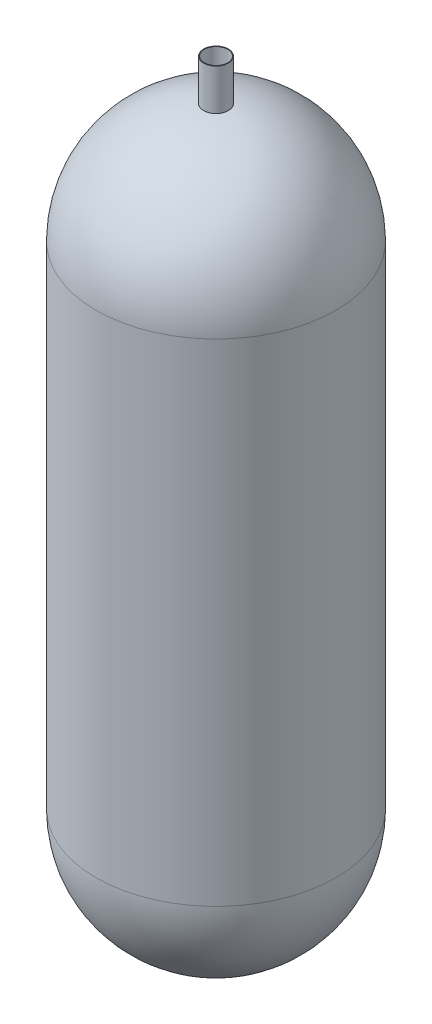
ISO-10303-21;
HEADER;
FILE_DESCRIPTION(('STEP AP214'),'2;1');
FILE_NAME('part.step','',(''),(''),'','','');
FILE_SCHEMA(('AUTOMOTIVE_DESIGN { 1 0 10303 214 1 1 1 1 }'));
ENDSEC;
DATA;
#1=APPLICATION_CONTEXT('core data for automotive mechanical design processes');
#2=APPLICATION_PROTOCOL_DEFINITION('international standard','automotive_design',2000,#1);
#3=PRODUCT_CONTEXT('',#1,'mechanical');
#4=PRODUCT('Part','Part','',(#3));
#5=PRODUCT_RELATED_PRODUCT_CATEGORY('part','',(#4));
#6=PRODUCT_DEFINITION_FORMATION('','',#4);
#7=PRODUCT_DEFINITION_CONTEXT('part definition',#1,'design');
#8=PRODUCT_DEFINITION('design','',#6,#7);
#9=PRODUCT_DEFINITION_SHAPE('','',#8);
#10=(LENGTH_UNIT() NAMED_UNIT(*) SI_UNIT(.MILLI.,.METRE.));
#11=(NAMED_UNIT(*) PLANE_ANGLE_UNIT() SI_UNIT($,.RADIAN.));
#12=(NAMED_UNIT(*) SI_UNIT($,.STERADIAN.) SOLID_ANGLE_UNIT());
#13=UNCERTAINTY_MEASURE_WITH_UNIT(LENGTH_MEASURE(1.E-05),#10,'distance_accuracy_value','');
#14=(GEOMETRIC_REPRESENTATION_CONTEXT(3) GLOBAL_UNCERTAINTY_ASSIGNED_CONTEXT((#13)) GLOBAL_UNIT_ASSIGNED_CONTEXT((#10,
#11,#12)) REPRESENTATION_CONTEXT('',''));
#15=CARTESIAN_POINT('',(0.,0.,0.));
#16=DIRECTION('',(0.,0.,1.));
#17=DIRECTION('',(1.,0.,0.));
#18=AXIS2_PLACEMENT_3D('',#15,#16,#17);
#19=CARTESIAN_POINT('',(0.,84.2306265294641,0.));
#20=DIRECTION('',(0.,1.,0.));
#21=DIRECTION('',(-1.,0.,0.));
#22=AXIS2_PLACEMENT_3D('',#19,#20,#21);
#23=SPHERICAL_SURFACE('',#22,74.4999999999999);
#24=CARTESIAN_POINT('',(0.,84.2306265294641,0.));
#25=DIRECTION('',(0.,1.,0.));
#26=DIRECTION('',(0.,0.,1.));
#27=AXIS2_PLACEMENT_3D('',#24,#25,#26);
#28=CIRCLE('',#27,74.4999999999999);
#29=CARTESIAN_POINT('',(0.,84.2306265294641,74.4999999999999));
#30=VERTEX_POINT('',#29);
#31=EDGE_CURVE('E11',#30,#30,#28,.T.);
#32=ORIENTED_EDGE('',*,*,#31,.T.);
#33=EDGE_LOOP('',(#32));
#34=FACE_BOUND('',#33,.T.);
#35=ADVANCED_FACE('F40',(#34),#23,.F.);
#36=CARTESIAN_POINT('',(0.,757.133757102828,0.));
#37=DIRECTION('',(0.,1.,0.));
#38=DIRECTION('',(0.,0.,1.));
#39=AXIS2_PLACEMENT_3D('',#36,#37,#38);
#40=CYLINDRICAL_SURFACE('',#39,74.4999999999999);
#41=ORIENTED_EDGE('',*,*,#31,.F.);
#42=EDGE_LOOP('',(#41));
#43=FACE_BOUND('',#42,.T.);
#44=CARTESIAN_POINT('',(0.,442.96408787173,0.));
#45=DIRECTION('',(0.,1.,0.));
#46=DIRECTION('',(0.,0.,1.));
#47=AXIS2_PLACEMENT_3D('',#44,#45,#46);
#48=CIRCLE('',#47,74.4999999999999);
#49=CARTESIAN_POINT('',(0.,442.96408787173,74.4999999999999));
#50=VERTEX_POINT('',#49);
#51=EDGE_CURVE('E49',#50,#50,#48,.T.);
#52=ORIENTED_EDGE('',*,*,#51,.T.);
#53=EDGE_LOOP('',(#52));
#54=FACE_BOUND('',#53,.T.);
#55=ADVANCED_FACE('F94',(#43,#54),#40,.F.);
#56=CARTESIAN_POINT('',(0.,442.96408787173,0.));
#57=DIRECTION('',(0.,1.,0.));
#58=DIRECTION('',(-1.,0.,0.));
#59=AXIS2_PLACEMENT_3D('',#56,#57,#58);
#60=SPHERICAL_SURFACE('',#59,74.5);
#61=CARTESIAN_POINT('',(0.,516.977600151583,0.));
#62=DIRECTION('',(0.,-1.,0.));
#63=DIRECTION('',(0.,0.,-1.));
#64=AXIS2_PLACEMENT_3D('',#61,#62,#63);
#65=CIRCLE('',#64,8.5);
#66=CARTESIAN_POINT('',(0.,516.977600151583,-8.5));
#67=VERTEX_POINT('',#66);
#68=EDGE_CURVE('E44',#67,#67,#65,.F.);
#69=ORIENTED_EDGE('',*,*,#68,.T.);
#70=EDGE_LOOP('',(#69));
#71=FACE_BOUND('',#70,.T.);
#72=ORIENTED_EDGE('',*,*,#51,.F.);
#73=EDGE_LOOP('',(#72));
#74=FACE_BOUND('',#73,.T.);
#75=ADVANCED_FACE('F42',(#71,#74),#60,.F.);
#76=CARTESIAN_POINT('',(0.,510.,0.));
#77=DIRECTION('',(0.,1.,0.));
#78=DIRECTION('',(0.,0.,1.));
#79=AXIS2_PLACEMENT_3D('',#76,#77,#78);
#80=CYLINDRICAL_SURFACE('',#79,8.5);
#81=CARTESIAN_POINT('',(0.,560.,0.));
#82=DIRECTION('',(0.,1.,0.));
#83=DIRECTION('',(0.,0.,1.));
#84=AXIS2_PLACEMENT_3D('',#81,#82,#83);
#85=CIRCLE('',#84,8.5);
#86=CARTESIAN_POINT('',(0.,560.,8.5));
#87=VERTEX_POINT('',#86);
#88=EDGE_CURVE('E72',#87,#87,#85,.T.);
#89=ORIENTED_EDGE('',*,*,#88,.T.);
#90=EDGE_LOOP('',(#89));
#91=FACE_BOUND('',#90,.T.);
#92=ORIENTED_EDGE('',*,*,#68,.F.);
#93=EDGE_LOOP('',(#92));
#94=FACE_BOUND('',#93,.T.);
#95=ADVANCED_FACE('F83',(#91,#94),#80,.F.);
#96=CARTESIAN_POINT('',(0.,84.2306265294641,0.));
#97=DIRECTION('',(0.,1.,0.));
#98=DIRECTION('',(-1.,0.,0.));
#99=AXIS2_PLACEMENT_3D('',#96,#97,#98);
#100=SPHERICAL_SURFACE('',#99,87.4999999999999);
#101=CARTESIAN_POINT('',(0.,84.2306265294641,0.));
#102=DIRECTION('',(0.,1.,0.));
#103=DIRECTION('',(0.,0.,1.));
#104=AXIS2_PLACEMENT_3D('',#101,#102,#103);
#105=CIRCLE('',#104,87.4999999999999);
#106=CARTESIAN_POINT('',(0.,84.2306265294641,87.4999999999999));
#107=VERTEX_POINT('',#106);
#108=EDGE_CURVE('E55',#107,#107,#105,.T.);
#109=ORIENTED_EDGE('',*,*,#108,.F.);
#110=EDGE_LOOP('',(#109));
#111=FACE_BOUND('',#110,.T.);
#112=ADVANCED_FACE('F85',(#111),#100,.T.);
#113=CARTESIAN_POINT('',(0.,757.133757102828,0.));
#114=DIRECTION('',(0.,1.,0.));
#115=DIRECTION('',(0.,0.,1.));
#116=AXIS2_PLACEMENT_3D('',#113,#114,#115);
#117=CYLINDRICAL_SURFACE('',#116,87.4999999999999);
#118=ORIENTED_EDGE('',*,*,#108,.T.);
#119=EDGE_LOOP('',(#118));
#120=FACE_BOUND('',#119,.T.);
#121=CARTESIAN_POINT('',(0.,442.96408787173,0.));
#122=DIRECTION('',(0.,1.,0.));
#123=DIRECTION('',(0.,0.,1.));
#124=AXIS2_PLACEMENT_3D('',#121,#122,#123);
#125=CIRCLE('',#124,87.4999999999999);
#126=CARTESIAN_POINT('',(0.,442.96408787173,87.4999999999999));
#127=VERTEX_POINT('',#126);
#128=EDGE_CURVE('E60',#127,#127,#125,.T.);
#129=ORIENTED_EDGE('',*,*,#128,.F.);
#130=EDGE_LOOP('',(#129));
#131=FACE_BOUND('',#130,.T.);
#132=ADVANCED_FACE('F91',(#120,#131),#117,.T.);
#133=CARTESIAN_POINT('',(0.,442.96408787173,0.));
#134=DIRECTION('',(0.,1.,0.));
#135=DIRECTION('',(-1.,0.,0.));
#136=AXIS2_PLACEMENT_3D('',#133,#134,#135);
#137=SPHERICAL_SURFACE('',#136,87.5);
#138=ORIENTED_EDGE('',*,*,#128,.T.);
#139=EDGE_LOOP('',(#138));
#140=FACE_BOUND('',#139,.T.);
#141=CARTESIAN_POINT('',(0.,530.,0.));
#142=DIRECTION('',(0.,1.,0.));
#143=DIRECTION('',(0.,0.,1.));
#144=AXIS2_PLACEMENT_3D('',#141,#142,#143);
#145=CIRCLE('',#144,9.);
#146=CARTESIAN_POINT('',(0.,530.,9.));
#147=VERTEX_POINT('',#146);
#148=EDGE_CURVE('E64',#147,#147,#145,.T.);
#149=ORIENTED_EDGE('',*,*,#148,.F.);
#150=EDGE_LOOP('',(#149));
#151=FACE_BOUND('',#150,.T.);
#152=ADVANCED_FACE('F105',(#140,#151),#137,.T.);
#153=CARTESIAN_POINT('',(0.,757.133757102828,0.));
#154=DIRECTION('',(0.,1.,0.));
#155=DIRECTION('',(0.,0.,1.));
#156=AXIS2_PLACEMENT_3D('',#153,#154,#155);
#157=CYLINDRICAL_SURFACE('',#156,9.);
#158=ORIENTED_EDGE('',*,*,#148,.T.);
#159=EDGE_LOOP('',(#158));
#160=FACE_BOUND('',#159,.T.);
#161=CARTESIAN_POINT('',(0.,560.,0.));
#162=DIRECTION('',(0.,1.,0.));
#163=DIRECTION('',(0.,0.,1.));
#164=AXIS2_PLACEMENT_3D('',#161,#162,#163);
#165=CIRCLE('',#164,9.);
#166=CARTESIAN_POINT('',(0.,560.,9.));
#167=VERTEX_POINT('',#166);
#168=EDGE_CURVE('E68',#167,#167,#165,.T.);
#169=ORIENTED_EDGE('',*,*,#168,.F.);
#170=EDGE_LOOP('',(#169));
#171=FACE_BOUND('',#170,.T.);
#172=ADVANCED_FACE('F109',(#160,#171),#157,.T.);
#173=CARTESIAN_POINT('',(-9.,560.,0.));
#174=DIRECTION('',(0.,1.,0.));
#175=DIRECTION('',(0.,0.,1.));
#176=AXIS2_PLACEMENT_3D('',#173,#174,#175);
#177=PLANE('',#176);
#178=ORIENTED_EDGE('',*,*,#88,.F.);
#179=EDGE_LOOP('',(#178));
#180=FACE_BOUND('',#179,.T.);
#181=ORIENTED_EDGE('',*,*,#168,.T.);
#182=EDGE_LOOP('',(#181));
#183=FACE_BOUND('',#182,.T.);
#184=ADVANCED_FACE('F112',(#180,#183),#177,.T.);
#185=CLOSED_SHELL('',(#35,#55,#75,#95,#112,#132,#152,#172,#184));
#186=MANIFOLD_SOLID_BREP('B2',#185);
#187=ADVANCED_BREP_SHAPE_REPRESENTATION('',(#18,#186),#14);
#188=SHAPE_DEFINITION_REPRESENTATION(#9,#187);
ENDSEC;
END-ISO-10303-21;
